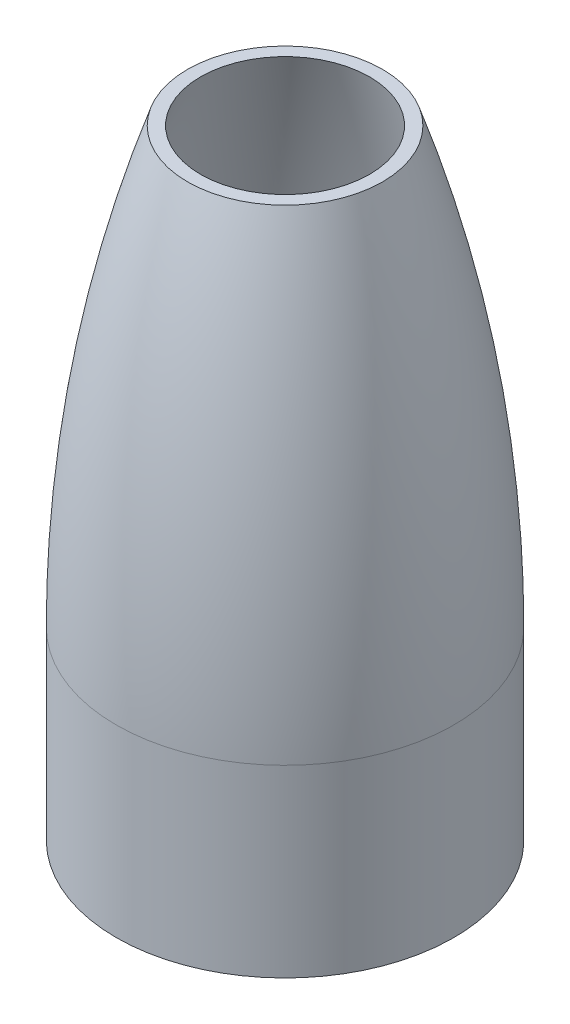
ISO-10303-21;
HEADER;
FILE_DESCRIPTION(('STEP AP214'),'2;1');
FILE_NAME('part.step','',(''),(''),'','','');
FILE_SCHEMA(('AUTOMOTIVE_DESIGN { 1 0 10303 214 1 1 1 1 }'));
ENDSEC;
DATA;
#1=APPLICATION_CONTEXT('core data for automotive mechanical design processes');
#2=APPLICATION_PROTOCOL_DEFINITION('international standard','automotive_design',2000,#1);
#3=PRODUCT_CONTEXT('',#1,'mechanical');
#4=PRODUCT('Part','Part','',(#3));
#5=PRODUCT_RELATED_PRODUCT_CATEGORY('part','',(#4));
#6=PRODUCT_DEFINITION_FORMATION('','',#4);
#7=PRODUCT_DEFINITION_CONTEXT('part definition',#1,'design');
#8=PRODUCT_DEFINITION('design','',#6,#7);
#9=PRODUCT_DEFINITION_SHAPE('','',#8);
#10=(LENGTH_UNIT() NAMED_UNIT(*) SI_UNIT(.MILLI.,.METRE.));
#11=(NAMED_UNIT(*) PLANE_ANGLE_UNIT() SI_UNIT($,.RADIAN.));
#12=(NAMED_UNIT(*) SI_UNIT($,.STERADIAN.) SOLID_ANGLE_UNIT());
#13=UNCERTAINTY_MEASURE_WITH_UNIT(LENGTH_MEASURE(1.E-05),#10,'distance_accuracy_value','');
#14=(GEOMETRIC_REPRESENTATION_CONTEXT(3) GLOBAL_UNCERTAINTY_ASSIGNED_CONTEXT((#13)) GLOBAL_UNIT_ASSIGNED_CONTEXT((#10,
#11,#12)) REPRESENTATION_CONTEXT('',''));
#15=CARTESIAN_POINT('',(0.,0.,0.));
#16=DIRECTION('',(0.,0.,1.));
#17=DIRECTION('',(1.,0.,0.));
#18=AXIS2_PLACEMENT_3D('',#15,#16,#17);
#19=CARTESIAN_POINT('',(0.,-8.70076363636362,0.));
#20=DIRECTION('',(0.,1.,0.));
#21=DIRECTION('',(0.,0.,1.));
#22=AXIS2_PLACEMENT_3D('',#19,#20,#21);
#23=DEGENERATE_TOROIDAL_SURFACE('',#22,194.000189328744,219.500189328744,.F.);
#24=CARTESIAN_POINT('',(0.,62.0992363636364,0.));
#25=DIRECTION('',(0.,1.,0.));
#26=DIRECTION('',(0.,0.,1.));
#27=AXIS2_PLACEMENT_3D('',#24,#25,#26);
#28=CIRCLE('',#27,13.7681747581748);
#29=CARTESIAN_POINT('',(0.,62.0992363636364,13.7681747581748));
#30=VERTEX_POINT('',#29);
#31=EDGE_CURVE('E56',#30,#30,#28,.T.);
#32=ORIENTED_EDGE('',*,*,#31,.T.);
#33=EDGE_LOOP('',(#32));
#34=FACE_BOUND('',#33,.T.);
#35=CARTESIAN_POINT('',(0.,-8.70076363636361,0.));
#36=DIRECTION('',(0.,1.,0.));
#37=DIRECTION('',(0.,0.,1.));
#38=AXIS2_PLACEMENT_3D('',#35,#36,#37);
#39=CIRCLE('',#38,25.5);
#40=CARTESIAN_POINT('',(0.,-8.70076363636361,25.5));
#41=VERTEX_POINT('',#40);
#42=EDGE_CURVE('E10',#41,#41,#39,.T.);
#43=ORIENTED_EDGE('',*,*,#42,.F.);
#44=EDGE_LOOP('',(#43));
#45=FACE_BOUND('',#44,.T.);
#46=ADVANCED_FACE('F34',(#34,#45),#23,.T.);
#47=CARTESIAN_POINT('',(0.,62.0992363636364,0.));
#48=DIRECTION('',(0.,1.,0.));
#49=DIRECTION('',(0.,0.,1.));
#50=AXIS2_PLACEMENT_3D('',#47,#48,#49);
#51=CYLINDRICAL_SURFACE('',#50,25.5);
#52=CARTESIAN_POINT('',(0.,-38.7007636363636,0.));
#53=DIRECTION('',(0.,1.,0.));
#54=DIRECTION('',(0.,0.,1.));
#55=AXIS2_PLACEMENT_3D('',#52,#53,#54);
#56=CIRCLE('',#55,25.5);
#57=CARTESIAN_POINT('',(0.,-38.7007636363636,25.5));
#58=VERTEX_POINT('',#57);
#59=EDGE_CURVE('E40',#58,#58,#56,.T.);
#60=ORIENTED_EDGE('',*,*,#59,.F.);
#61=EDGE_LOOP('',(#60));
#62=FACE_BOUND('',#61,.T.);
#63=ORIENTED_EDGE('',*,*,#42,.T.);
#64=EDGE_LOOP('',(#63));
#65=FACE_BOUND('',#64,.T.);
#66=ADVANCED_FACE('F74',(#62,#65),#51,.F.);
#67=CARTESIAN_POINT('',(27.5,-38.7007636363636,0.));
#68=DIRECTION('',(0.,-1.,0.));
#69=DIRECTION('',(0.,0.,-1.));
#70=AXIS2_PLACEMENT_3D('',#67,#68,#69);
#71=PLANE('',#70);
#72=ORIENTED_EDGE('',*,*,#59,.T.);
#73=EDGE_LOOP('',(#72));
#74=FACE_BOUND('',#73,.T.);
#75=CARTESIAN_POINT('',(0.,-38.7007636363636,0.));
#76=DIRECTION('',(0.,1.,0.));
#77=DIRECTION('',(0.,0.,1.));
#78=AXIS2_PLACEMENT_3D('',#75,#76,#77);
#79=CIRCLE('',#78,27.5);
#80=CARTESIAN_POINT('',(0.,-38.7007636363636,27.5));
#81=VERTEX_POINT('',#80);
#82=EDGE_CURVE('E44',#81,#81,#79,.T.);
#83=ORIENTED_EDGE('',*,*,#82,.F.);
#84=EDGE_LOOP('',(#83));
#85=FACE_BOUND('',#84,.T.);
#86=ADVANCED_FACE('F78',(#74,#85),#71,.T.);
#87=CARTESIAN_POINT('',(0.,62.0992363636364,0.));
#88=DIRECTION('',(0.,1.,0.));
#89=DIRECTION('',(0.,0.,1.));
#90=AXIS2_PLACEMENT_3D('',#87,#88,#89);
#91=CYLINDRICAL_SURFACE('',#90,27.5);
#92=ORIENTED_EDGE('',*,*,#82,.T.);
#93=EDGE_LOOP('',(#92));
#94=FACE_BOUND('',#93,.T.);
#95=CARTESIAN_POINT('',(0.,-8.70076363636361,0.));
#96=DIRECTION('',(0.,1.,0.));
#97=DIRECTION('',(0.,0.,1.));
#98=AXIS2_PLACEMENT_3D('',#95,#96,#97);
#99=CIRCLE('',#98,27.5);
#100=CARTESIAN_POINT('',(0.,-8.70076363636361,27.5));
#101=VERTEX_POINT('',#100);
#102=EDGE_CURVE('E48',#101,#101,#99,.T.);
#103=ORIENTED_EDGE('',*,*,#102,.F.);
#104=EDGE_LOOP('',(#103));
#105=FACE_BOUND('',#104,.T.);
#106=ADVANCED_FACE('F70',(#94,#105),#91,.T.);
#107=CARTESIAN_POINT('',(0.,-8.70076363636362,0.));
#108=DIRECTION('',(0.,1.,0.));
#109=DIRECTION('',(0.,0.,1.));
#110=AXIS2_PLACEMENT_3D('',#107,#108,#109);
#111=DEGENERATE_TOROIDAL_SURFACE('',#110,194.000189328744,221.500189328744,.F.);
#112=CARTESIAN_POINT('',(0.,62.0992363636364,0.));
#113=DIRECTION('',(0.,1.,0.));
#114=DIRECTION('',(0.,0.,1.));
#115=AXIS2_PLACEMENT_3D('',#112,#113,#114);
#116=CIRCLE('',#115,15.88);
#117=CARTESIAN_POINT('',(0.,62.0992363636364,15.88));
#118=VERTEX_POINT('',#117);
#119=EDGE_CURVE('E53',#118,#118,#116,.T.);
#120=ORIENTED_EDGE('',*,*,#119,.F.);
#121=EDGE_LOOP('',(#120));
#122=FACE_BOUND('',#121,.T.);
#123=ORIENTED_EDGE('',*,*,#102,.T.);
#124=EDGE_LOOP('',(#123));
#125=FACE_BOUND('',#124,.T.);
#126=ADVANCED_FACE('F64',(#122,#125),#111,.F.);
#127=CARTESIAN_POINT('',(13.7681747581748,62.0992363636364,0.));
#128=DIRECTION('',(0.,1.,0.));
#129=DIRECTION('',(0.,0.,1.));
#130=AXIS2_PLACEMENT_3D('',#127,#128,#129);
#131=PLANE('',#130);
#132=ORIENTED_EDGE('',*,*,#119,.T.);
#133=EDGE_LOOP('',(#132));
#134=FACE_BOUND('',#133,.T.);
#135=ORIENTED_EDGE('',*,*,#31,.F.);
#136=EDGE_LOOP('',(#135));
#137=FACE_BOUND('',#136,.T.);
#138=ADVANCED_FACE('F62',(#134,#137),#131,.T.);
#139=CLOSED_SHELL('',(#46,#66,#86,#106,#126,#138));
#140=MANIFOLD_SOLID_BREP('B2',#139);
#141=ADVANCED_BREP_SHAPE_REPRESENTATION('',(#18,#140),#14);
#142=SHAPE_DEFINITION_REPRESENTATION(#9,#141);
ENDSEC;
END-ISO-10303-21;
